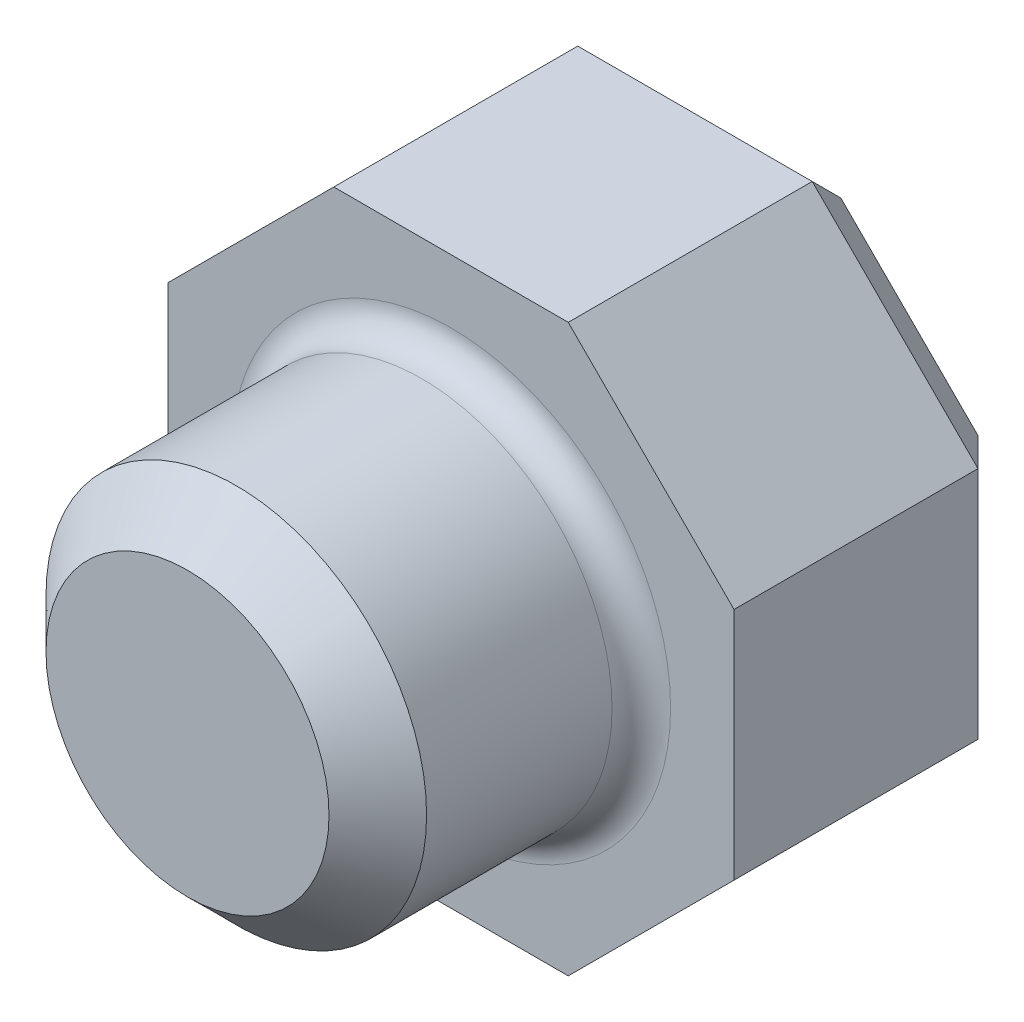
ISO-10303-21;
HEADER;
FILE_DESCRIPTION(('STEP AP214'),'2;1');
FILE_NAME('part.step','',(''),(''),'','','');
FILE_SCHEMA(('AUTOMOTIVE_DESIGN { 1 0 10303 214 1 1 1 1 }'));
ENDSEC;
DATA;
#1=APPLICATION_CONTEXT('core data for automotive mechanical design processes');
#2=APPLICATION_PROTOCOL_DEFINITION('international standard','automotive_design',2000,#1);
#3=PRODUCT_CONTEXT('',#1,'mechanical');
#4=PRODUCT('Part','Part','',(#3));
#5=PRODUCT_RELATED_PRODUCT_CATEGORY('part','',(#4));
#6=PRODUCT_DEFINITION_FORMATION('','',#4);
#7=PRODUCT_DEFINITION_CONTEXT('part definition',#1,'design');
#8=PRODUCT_DEFINITION('design','',#6,#7);
#9=PRODUCT_DEFINITION_SHAPE('','',#8);
#10=(LENGTH_UNIT() NAMED_UNIT(*) SI_UNIT(.MILLI.,.METRE.));
#11=(NAMED_UNIT(*) PLANE_ANGLE_UNIT() SI_UNIT($,.RADIAN.));
#12=(NAMED_UNIT(*) SI_UNIT($,.STERADIAN.) SOLID_ANGLE_UNIT());
#13=UNCERTAINTY_MEASURE_WITH_UNIT(LENGTH_MEASURE(1.E-05),#10,'distance_accuracy_value','');
#14=(GEOMETRIC_REPRESENTATION_CONTEXT(3) GLOBAL_UNCERTAINTY_ASSIGNED_CONTEXT((#13)) GLOBAL_UNIT_ASSIGNED_CONTEXT((#10,
#11,#12)) REPRESENTATION_CONTEXT('',''));
#15=CARTESIAN_POINT('',(0.,0.,0.));
#16=DIRECTION('',(0.,0.,1.));
#17=DIRECTION('',(1.,0.,0.));
#18=AXIS2_PLACEMENT_3D('',#15,#16,#17);
#19=CARTESIAN_POINT('',(5.8,2.40243866176395,6.));
#20=DIRECTION('',(-0.707106781186548,-0.707106781186547,0.));
#21=DIRECTION('',(0.707106781186547,-0.707106781186548,0.));
#22=AXIS2_PLACEMENT_3D('',#19,#20,#21);
#23=PLANE('',#22);
#24=DIRECTION('',(0.,0.,-1.));
#25=VECTOR('',#24,1.);
#26=CARTESIAN_POINT('',(5.8,2.40243866176395,6.));
#27=LINE('',#26,#25);
#28=CARTESIAN_POINT('',(5.8,2.40243866176395,6.));
#29=VERTEX_POINT('',#28);
#30=CARTESIAN_POINT('',(5.8,2.40243866176395,1.));
#31=VERTEX_POINT('',#30);
#32=EDGE_CURVE('E250',#29,#31,#27,.T.);
#33=ORIENTED_EDGE('',*,*,#32,.T.);
#34=DIRECTION('',(-0.707106781186547,0.707106781186548,0.));
#35=VECTOR('',#34,1.);
#36=CARTESIAN_POINT('',(5.8,2.40243866176395,1.));
#37=LINE('',#36,#35);
#38=CARTESIAN_POINT('',(2.40243866176395,5.8,1.));
#39=VERTEX_POINT('',#38);
#40=EDGE_CURVE('E11',#31,#39,#37,.T.);
#41=ORIENTED_EDGE('',*,*,#40,.T.);
#42=DIRECTION('',(0.,0.,-1.));
#43=VECTOR('',#42,1.);
#44=CARTESIAN_POINT('',(2.40243866176395,5.8,6.));
#45=LINE('',#44,#43);
#46=CARTESIAN_POINT('',(2.40243866176395,5.8,6.));
#47=VERTEX_POINT('',#46);
#48=EDGE_CURVE('E133',#47,#39,#45,.T.);
#49=ORIENTED_EDGE('',*,*,#48,.F.);
#50=DIRECTION('',(-0.707106781186547,0.707106781186548,0.));
#51=VECTOR('',#50,1.);
#52=CARTESIAN_POINT('',(5.8,2.40243866176395,6.));
#53=LINE('',#52,#51);
#54=EDGE_CURVE('E138',#29,#47,#53,.T.);
#55=ORIENTED_EDGE('',*,*,#54,.F.);
#56=EDGE_LOOP('',(#33,#41,#49,#55));
#57=FACE_BOUND('',#56,.T.);
#58=ADVANCED_FACE('F41',(#57),#23,.F.);
#59=CARTESIAN_POINT('',(2.40243866176395,5.8,6.));
#60=DIRECTION('',(0.,-1.,0.));
#61=DIRECTION('',(1.,0.,0.));
#62=AXIS2_PLACEMENT_3D('',#59,#60,#61);
#63=PLANE('',#62);
#64=ORIENTED_EDGE('',*,*,#48,.T.);
#65=DIRECTION('',(-1.,0.,0.));
#66=VECTOR('',#65,1.);
#67=CARTESIAN_POINT('',(2.40243866176395,5.8,1.));
#68=LINE('',#67,#66);
#69=CARTESIAN_POINT('',(-2.40243866176395,5.8,1.));
#70=VERTEX_POINT('',#69);
#71=EDGE_CURVE('E51',#39,#70,#68,.T.);
#72=ORIENTED_EDGE('',*,*,#71,.T.);
#73=DIRECTION('',(0.,0.,-1.));
#74=VECTOR('',#73,1.);
#75=CARTESIAN_POINT('',(-2.40243866176395,5.8,6.));
#76=LINE('',#75,#74);
#77=CARTESIAN_POINT('',(-2.40243866176395,5.8,6.));
#78=VERTEX_POINT('',#77);
#79=EDGE_CURVE('E134',#78,#70,#76,.T.);
#80=ORIENTED_EDGE('',*,*,#79,.F.);
#81=DIRECTION('',(-1.,0.,0.));
#82=VECTOR('',#81,1.);
#83=CARTESIAN_POINT('',(2.40243866176395,5.8,6.));
#84=LINE('',#83,#82);
#85=EDGE_CURVE('E130',#47,#78,#84,.T.);
#86=ORIENTED_EDGE('',*,*,#85,.F.);
#87=EDGE_LOOP('',(#64,#72,#80,#86));
#88=FACE_BOUND('',#87,.T.);
#89=ADVANCED_FACE('F132',(#88),#63,.F.);
#90=CARTESIAN_POINT('',(-2.40243866176395,5.8,6.));
#91=DIRECTION('',(0.707106781186547,-0.707106781186548,0.));
#92=DIRECTION('',(0.707106781186548,0.707106781186547,0.));
#93=AXIS2_PLACEMENT_3D('',#90,#91,#92);
#94=PLANE('',#93);
#95=ORIENTED_EDGE('',*,*,#79,.T.);
#96=DIRECTION('',(-0.707106781186548,-0.707106781186547,0.));
#97=VECTOR('',#96,1.);
#98=CARTESIAN_POINT('',(-2.40243866176395,5.8,1.));
#99=LINE('',#98,#97);
#100=CARTESIAN_POINT('',(-5.8,2.40243866176395,1.));
#101=VERTEX_POINT('',#100);
#102=EDGE_CURVE('E191',#70,#101,#99,.T.);
#103=ORIENTED_EDGE('',*,*,#102,.T.);
#104=DIRECTION('',(0.,0.,-1.));
#105=VECTOR('',#104,1.);
#106=CARTESIAN_POINT('',(-5.8,2.40243866176395,6.));
#107=LINE('',#106,#105);
#108=CARTESIAN_POINT('',(-5.8,2.40243866176395,6.));
#109=VERTEX_POINT('',#108);
#110=EDGE_CURVE('E151',#109,#101,#107,.T.);
#111=ORIENTED_EDGE('',*,*,#110,.F.);
#112=DIRECTION('',(-0.707106781186547,-0.707106781186547,0.));
#113=VECTOR('',#112,1.);
#114=CARTESIAN_POINT('',(-2.40243866176395,5.8,6.));
#115=LINE('',#114,#113);
#116=EDGE_CURVE('E137',#78,#109,#115,.T.);
#117=ORIENTED_EDGE('',*,*,#116,.F.);
#118=EDGE_LOOP('',(#95,#103,#111,#117));
#119=FACE_BOUND('',#118,.T.);
#120=ADVANCED_FACE('F269',(#119),#94,.F.);
#121=CARTESIAN_POINT('',(-5.8,2.40243866176395,6.));
#122=DIRECTION('',(1.,0.,0.));
#123=DIRECTION('',(0.,1.,0.));
#124=AXIS2_PLACEMENT_3D('',#121,#122,#123);
#125=PLANE('',#124);
#126=ORIENTED_EDGE('',*,*,#110,.T.);
#127=DIRECTION('',(0.,-1.,0.));
#128=VECTOR('',#127,1.);
#129=CARTESIAN_POINT('',(-5.8,2.40243866176395,1.));
#130=LINE('',#129,#128);
#131=CARTESIAN_POINT('',(-5.8,-2.40243866176395,1.));
#132=VERTEX_POINT('',#131);
#133=EDGE_CURVE('E189',#101,#132,#130,.T.);
#134=ORIENTED_EDGE('',*,*,#133,.T.);
#135=DIRECTION('',(0.,0.,-1.));
#136=VECTOR('',#135,1.);
#137=CARTESIAN_POINT('',(-5.8,-2.40243866176395,6.));
#138=LINE('',#137,#136);
#139=CARTESIAN_POINT('',(-5.8,-2.40243866176395,6.));
#140=VERTEX_POINT('',#139);
#141=EDGE_CURVE('E259',#140,#132,#138,.T.);
#142=ORIENTED_EDGE('',*,*,#141,.F.);
#143=DIRECTION('',(0.,-1.,0.));
#144=VECTOR('',#143,1.);
#145=CARTESIAN_POINT('',(-5.8,2.40243866176395,6.));
#146=LINE('',#145,#144);
#147=EDGE_CURVE('E267',#109,#140,#146,.T.);
#148=ORIENTED_EDGE('',*,*,#147,.F.);
#149=EDGE_LOOP('',(#126,#134,#142,#148));
#150=FACE_BOUND('',#149,.T.);
#151=ADVANCED_FACE('F265',(#150),#125,.F.);
#152=CARTESIAN_POINT('',(-5.8,-2.40243866176395,6.));
#153=DIRECTION('',(0.707106781186548,0.707106781186547,0.));
#154=DIRECTION('',(-0.707106781186547,0.707106781186548,0.));
#155=AXIS2_PLACEMENT_3D('',#152,#153,#154);
#156=PLANE('',#155);
#157=ORIENTED_EDGE('',*,*,#141,.T.);
#158=DIRECTION('',(0.707106781186547,-0.707106781186548,0.));
#159=VECTOR('',#158,1.);
#160=CARTESIAN_POINT('',(-5.8,-2.40243866176395,1.));
#161=LINE('',#160,#159);
#162=CARTESIAN_POINT('',(-2.40243866176395,-5.8,1.));
#163=VERTEX_POINT('',#162);
#164=EDGE_CURVE('E187',#132,#163,#161,.T.);
#165=ORIENTED_EDGE('',*,*,#164,.T.);
#166=DIRECTION('',(0.,0.,-1.));
#167=VECTOR('',#166,1.);
#168=CARTESIAN_POINT('',(-2.40243866176395,-5.8,6.));
#169=LINE('',#168,#167);
#170=CARTESIAN_POINT('',(-2.40243866176395,-5.8,6.));
#171=VERTEX_POINT('',#170);
#172=EDGE_CURVE('E252',#171,#163,#169,.T.);
#173=ORIENTED_EDGE('',*,*,#172,.F.);
#174=DIRECTION('',(0.707106781186547,-0.707106781186548,0.));
#175=VECTOR('',#174,1.);
#176=CARTESIAN_POINT('',(-5.8,-2.40243866176395,6.));
#177=LINE('',#176,#175);
#178=EDGE_CURVE('E504',#140,#171,#177,.T.);
#179=ORIENTED_EDGE('',*,*,#178,.F.);
#180=EDGE_LOOP('',(#157,#165,#173,#179));
#181=FACE_BOUND('',#180,.T.);
#182=ADVANCED_FACE('F375',(#181),#156,.F.);
#183=CARTESIAN_POINT('',(-2.40243866176395,-5.8,6.));
#184=DIRECTION('',(0.,1.,0.));
#185=DIRECTION('',(-1.,0.,0.));
#186=AXIS2_PLACEMENT_3D('',#183,#184,#185);
#187=PLANE('',#186);
#188=ORIENTED_EDGE('',*,*,#172,.T.);
#189=DIRECTION('',(1.,0.,0.));
#190=VECTOR('',#189,1.);
#191=CARTESIAN_POINT('',(-2.40243866176395,-5.8,1.));
#192=LINE('',#191,#190);
#193=CARTESIAN_POINT('',(2.40243866176395,-5.8,1.));
#194=VERTEX_POINT('',#193);
#195=EDGE_CURVE('E185',#163,#194,#192,.T.);
#196=ORIENTED_EDGE('',*,*,#195,.T.);
#197=DIRECTION('',(0.,0.,-1.));
#198=VECTOR('',#197,1.);
#199=CARTESIAN_POINT('',(2.40243866176395,-5.8,6.));
#200=LINE('',#199,#198);
#201=CARTESIAN_POINT('',(2.40243866176395,-5.8,6.));
#202=VERTEX_POINT('',#201);
#203=EDGE_CURVE('E247',#202,#194,#200,.T.);
#204=ORIENTED_EDGE('',*,*,#203,.F.);
#205=DIRECTION('',(1.,0.,0.));
#206=VECTOR('',#205,1.);
#207=CARTESIAN_POINT('',(-2.40243866176395,-5.8,6.));
#208=LINE('',#207,#206);
#209=EDGE_CURVE('E506',#171,#202,#208,.T.);
#210=ORIENTED_EDGE('',*,*,#209,.F.);
#211=EDGE_LOOP('',(#188,#196,#204,#210));
#212=FACE_BOUND('',#211,.T.);
#213=ADVANCED_FACE('F367',(#212),#187,.F.);
#214=CARTESIAN_POINT('',(2.40243866176395,-5.8,6.));
#215=DIRECTION('',(-0.707106781186548,0.707106781186547,0.));
#216=DIRECTION('',(-0.707106781186547,-0.707106781186548,0.));
#217=AXIS2_PLACEMENT_3D('',#214,#215,#216);
#218=PLANE('',#217);
#219=ORIENTED_EDGE('',*,*,#203,.T.);
#220=DIRECTION('',(0.707106781186547,0.707106781186548,0.));
#221=VECTOR('',#220,1.);
#222=CARTESIAN_POINT('',(2.40243866176395,-5.8,1.));
#223=LINE('',#222,#221);
#224=CARTESIAN_POINT('',(5.8,-2.40243866176395,1.));
#225=VERTEX_POINT('',#224);
#226=EDGE_CURVE('E183',#194,#225,#223,.T.);
#227=ORIENTED_EDGE('',*,*,#226,.T.);
#228=DIRECTION('',(0.,0.,-1.));
#229=VECTOR('',#228,1.);
#230=CARTESIAN_POINT('',(5.8,-2.40243866176395,6.));
#231=LINE('',#230,#229);
#232=CARTESIAN_POINT('',(5.8,-2.40243866176395,6.));
#233=VERTEX_POINT('',#232);
#234=EDGE_CURVE('E245',#233,#225,#231,.T.);
#235=ORIENTED_EDGE('',*,*,#234,.F.);
#236=DIRECTION('',(0.707106781186547,0.707106781186548,0.));
#237=VECTOR('',#236,1.);
#238=CARTESIAN_POINT('',(2.40243866176395,-5.8,6.));
#239=LINE('',#238,#237);
#240=EDGE_CURVE('E508',#202,#233,#239,.T.);
#241=ORIENTED_EDGE('',*,*,#240,.F.);
#242=EDGE_LOOP('',(#219,#227,#235,#241));
#243=FACE_BOUND('',#242,.T.);
#244=ADVANCED_FACE('F243',(#243),#218,.F.);
#245=CARTESIAN_POINT('',(5.8,-2.40243866176395,6.));
#246=DIRECTION('',(-1.,0.,0.));
#247=DIRECTION('',(0.,0.,1.));
#248=AXIS2_PLACEMENT_3D('',#245,#246,#247);
#249=PLANE('',#248);
#250=ORIENTED_EDGE('',*,*,#234,.T.);
#251=DIRECTION('',(0.,1.,0.));
#252=VECTOR('',#251,1.);
#253=CARTESIAN_POINT('',(5.8,-2.40243866176395,1.));
#254=LINE('',#253,#252);
#255=EDGE_CURVE('E163',#225,#31,#254,.T.);
#256=ORIENTED_EDGE('',*,*,#255,.T.);
#257=ORIENTED_EDGE('',*,*,#32,.F.);
#258=DIRECTION('',(0.,1.,0.));
#259=VECTOR('',#258,1.);
#260=CARTESIAN_POINT('',(5.8,-2.40243866176395,6.));
#261=LINE('',#260,#259);
#262=EDGE_CURVE('E143',#233,#29,#261,.T.);
#263=ORIENTED_EDGE('',*,*,#262,.F.);
#264=EDGE_LOOP('',(#250,#256,#257,#263));
#265=FACE_BOUND('',#264,.T.);
#266=ADVANCED_FACE('F249',(#265),#249,.F.);
#267=CARTESIAN_POINT('',(0.,0.,6.));
#268=DIRECTION('',(0.,0.,1.));
#269=DIRECTION('',(1.,0.,0.));
#270=AXIS2_PLACEMENT_3D('',#267,#268,#269);
#271=PLANE('',#270);
#272=CARTESIAN_POINT('',(0.,0.,6.));
#273=DIRECTION('',(0.,0.,1.));
#274=DIRECTION('',(1.,0.,0.));
#275=AXIS2_PLACEMENT_3D('',#272,#273,#274);
#276=CIRCLE('',#275,4.5);
#277=CARTESIAN_POINT('',(4.5,0.,6.));
#278=VERTEX_POINT('',#277);
#279=EDGE_CURVE('E160',#278,#278,#276,.F.);
#280=ORIENTED_EDGE('',*,*,#279,.T.);
#281=EDGE_LOOP('',(#280));
#282=FACE_BOUND('',#281,.T.);
#283=ORIENTED_EDGE('',*,*,#54,.T.);
#284=ORIENTED_EDGE('',*,*,#85,.T.);
#285=ORIENTED_EDGE('',*,*,#116,.T.);
#286=ORIENTED_EDGE('',*,*,#147,.T.);
#287=ORIENTED_EDGE('',*,*,#178,.T.);
#288=ORIENTED_EDGE('',*,*,#209,.T.);
#289=ORIENTED_EDGE('',*,*,#240,.T.);
#290=ORIENTED_EDGE('',*,*,#262,.T.);
#291=EDGE_LOOP('',(#283,#284,#285,#286,#287,#288,#289,#290));
#292=FACE_BOUND('',#291,.T.);
#293=ADVANCED_FACE('F141',(#282,#292),#271,.T.);
#294=CARTESIAN_POINT('',(0.,0.,0.));
#295=DIRECTION('',(0.,0.,1.));
#296=DIRECTION('',(1.,0.,0.));
#297=AXIS2_PLACEMENT_3D('',#294,#295,#296);
#298=PLANE('',#297);
#299=DIRECTION('',(0.707106781186547,-0.707106781186548,0.));
#300=VECTOR('',#299,1.);
#301=CARTESIAN_POINT('',(3.39411254969543,3.39411254969543,0.));
#302=LINE('',#301,#300);
#303=CARTESIAN_POINT('',(1.98822509939086,4.8,0.));
#304=VERTEX_POINT('',#303);
#305=CARTESIAN_POINT('',(4.8,1.98822509939086,0.));
#306=VERTEX_POINT('',#305);
#307=EDGE_CURVE('E166',#304,#306,#302,.T.);
#308=ORIENTED_EDGE('',*,*,#307,.T.);
#309=DIRECTION('',(0.,-1.,0.));
#310=VECTOR('',#309,1.);
#311=CARTESIAN_POINT('',(4.8,0.,0.));
#312=LINE('',#311,#310);
#313=CARTESIAN_POINT('',(4.8,-1.98822509939085,0.));
#314=VERTEX_POINT('',#313);
#315=EDGE_CURVE('E180',#306,#314,#312,.T.);
#316=ORIENTED_EDGE('',*,*,#315,.T.);
#317=DIRECTION('',(-0.707106781186547,-0.707106781186548,0.));
#318=VECTOR('',#317,1.);
#319=CARTESIAN_POINT('',(3.39411254969543,-3.39411254969543,0.));
#320=LINE('',#319,#318);
#321=CARTESIAN_POINT('',(1.98822509939086,-4.8,0.));
#322=VERTEX_POINT('',#321);
#323=EDGE_CURVE('E178',#314,#322,#320,.T.);
#324=ORIENTED_EDGE('',*,*,#323,.T.);
#325=DIRECTION('',(-1.,0.,0.));
#326=VECTOR('',#325,1.);
#327=CARTESIAN_POINT('',(0.,-4.8,0.));
#328=LINE('',#327,#326);
#329=CARTESIAN_POINT('',(-1.98822509939086,-4.8,0.));
#330=VERTEX_POINT('',#329);
#331=EDGE_CURVE('E176',#322,#330,#328,.T.);
#332=ORIENTED_EDGE('',*,*,#331,.T.);
#333=DIRECTION('',(-0.707106781186547,0.707106781186548,0.));
#334=VECTOR('',#333,1.);
#335=CARTESIAN_POINT('',(-3.39411254969543,-3.39411254969543,0.));
#336=LINE('',#335,#334);
#337=CARTESIAN_POINT('',(-4.8,-1.98822509939086,0.));
#338=VERTEX_POINT('',#337);
#339=EDGE_CURVE('E174',#330,#338,#336,.T.);
#340=ORIENTED_EDGE('',*,*,#339,.T.);
#341=DIRECTION('',(0.,1.,0.));
#342=VECTOR('',#341,1.);
#343=CARTESIAN_POINT('',(-4.8,0.,0.));
#344=LINE('',#343,#342);
#345=CARTESIAN_POINT('',(-4.8,1.98822509939085,0.));
#346=VERTEX_POINT('',#345);
#347=EDGE_CURVE('E172',#338,#346,#344,.T.);
#348=ORIENTED_EDGE('',*,*,#347,.T.);
#349=DIRECTION('',(0.707106781186548,0.707106781186547,0.));
#350=VECTOR('',#349,1.);
#351=CARTESIAN_POINT('',(-3.39411254969543,3.39411254969543,0.));
#352=LINE('',#351,#350);
#353=CARTESIAN_POINT('',(-1.98822509939086,4.8,0.));
#354=VERTEX_POINT('',#353);
#355=EDGE_CURVE('E170',#346,#354,#352,.T.);
#356=ORIENTED_EDGE('',*,*,#355,.T.);
#357=DIRECTION('',(1.,0.,0.));
#358=VECTOR('',#357,1.);
#359=CARTESIAN_POINT('',(0.,4.8,0.));
#360=LINE('',#359,#358);
#361=EDGE_CURVE('E168',#354,#304,#360,.T.);
#362=ORIENTED_EDGE('',*,*,#361,.T.);
#363=EDGE_LOOP('',(#308,#316,#324,#332,#340,#348,#356,#362));
#364=FACE_BOUND('',#363,.T.);
#365=ADVANCED_FACE('F226',(#364),#298,.F.);
#366=CARTESIAN_POINT('',(0.,0.,11.4));
#367=DIRECTION('',(0.,0.,-1.));
#368=DIRECTION('',(-1.,0.,0.));
#369=AXIS2_PLACEMENT_3D('',#366,#367,#368);
#370=CYLINDRICAL_SURFACE('',#369,3.9);
#371=CARTESIAN_POINT('',(0.,0.,6.6));
#372=DIRECTION('',(0.,0.,1.));
#373=DIRECTION('',(1.,0.,0.));
#374=AXIS2_PLACEMENT_3D('',#371,#372,#373);
#375=CIRCLE('',#374,3.9);
#376=CARTESIAN_POINT('',(-3.9,0.,6.6));
#377=VERTEX_POINT('',#376);
#378=EDGE_CURVE('E157',#377,#377,#375,.T.);
#379=CARTESIAN_POINT('',(0.,0.,10.4));
#380=DIRECTION('',(0.,0.,1.));
#381=DIRECTION('',(1.,0.,0.));
#382=AXIS2_PLACEMENT_3D('',#379,#380,#381);
#383=CIRCLE('',#382,3.9);
#384=CARTESIAN_POINT('',(-3.9,0.,10.4));
#385=VERTEX_POINT('',#384);
#386=EDGE_CURVE('E149',#385,#385,#383,.F.);
#387=CARTESIAN_POINT('',(-3.9,0.,6.6));
#388=CARTESIAN_POINT('',(-3.9,0.,6.63958333333333));
#389=CARTESIAN_POINT('',(-3.9,0.,6.67916666666667));
#390=CARTESIAN_POINT('',(-3.9,0.,6.75833333333333));
#391=CARTESIAN_POINT('',(-3.9,0.,6.79791666666667));
#392=CARTESIAN_POINT('',(-3.9,0.,6.87708333333333));
#393=CARTESIAN_POINT('',(-3.9,0.,6.91666666666667));
#394=CARTESIAN_POINT('',(-3.9,0.,6.99583333333333));
#395=CARTESIAN_POINT('',(-3.9,0.,7.03541666666667));
#396=CARTESIAN_POINT('',(-3.9,0.,7.11458333333333));
#397=CARTESIAN_POINT('',(-3.9,0.,7.15416666666667));
#398=CARTESIAN_POINT('',(-3.9,0.,7.23333333333333));
#399=CARTESIAN_POINT('',(-3.9,0.,7.27291666666667));
#400=CARTESIAN_POINT('',(-3.9,0.,7.35208333333333));
#401=CARTESIAN_POINT('',(-3.9,0.,7.39166666666667));
#402=CARTESIAN_POINT('',(-3.9,0.,7.47083333333333));
#403=CARTESIAN_POINT('',(-3.9,0.,7.51041666666667));
#404=CARTESIAN_POINT('',(-3.9,0.,7.58958333333333));
#405=CARTESIAN_POINT('',(-3.9,0.,7.62916666666667));
#406=CARTESIAN_POINT('',(-3.9,0.,7.70833333333333));
#407=CARTESIAN_POINT('',(-3.9,0.,7.74791666666667));
#408=CARTESIAN_POINT('',(-3.9,0.,7.82708333333333));
#409=CARTESIAN_POINT('',(-3.9,0.,7.86666666666667));
#410=CARTESIAN_POINT('',(-3.9,0.,7.94583333333333));
#411=CARTESIAN_POINT('',(-3.9,0.,7.98541666666667));
#412=CARTESIAN_POINT('',(-3.9,0.,8.06458333333333));
#413=CARTESIAN_POINT('',(-3.9,0.,8.10416666666667));
#414=CARTESIAN_POINT('',(-3.9,0.,8.18333333333334));
#415=CARTESIAN_POINT('',(-3.9,0.,8.22291666666667));
#416=CARTESIAN_POINT('',(-3.9,0.,8.30208333333334));
#417=CARTESIAN_POINT('',(-3.9,0.,8.34166666666667));
#418=CARTESIAN_POINT('',(-3.9,0.,8.42083333333334));
#419=CARTESIAN_POINT('',(-3.9,0.,8.46041666666667));
#420=CARTESIAN_POINT('',(-3.9,0.,8.53958333333333));
#421=CARTESIAN_POINT('',(-3.9,0.,8.57916666666667));
#422=CARTESIAN_POINT('',(-3.9,0.,8.65833333333333));
#423=CARTESIAN_POINT('',(-3.9,0.,8.69791666666667));
#424=CARTESIAN_POINT('',(-3.9,0.,8.77708333333334));
#425=CARTESIAN_POINT('',(-3.9,0.,8.81666666666667));
#426=CARTESIAN_POINT('',(-3.9,0.,8.89583333333334));
#427=CARTESIAN_POINT('',(-3.9,0.,8.93541666666667));
#428=CARTESIAN_POINT('',(-3.9,0.,9.01458333333334));
#429=CARTESIAN_POINT('',(-3.9,0.,9.05416666666667));
#430=CARTESIAN_POINT('',(-3.9,0.,9.13333333333334));
#431=CARTESIAN_POINT('',(-3.9,0.,9.17291666666667));
#432=CARTESIAN_POINT('',(-3.9,0.,9.25208333333334));
#433=CARTESIAN_POINT('',(-3.9,0.,9.29166666666667));
#434=CARTESIAN_POINT('',(-3.9,0.,9.37083333333334));
#435=CARTESIAN_POINT('',(-3.9,0.,9.41041666666667));
#436=CARTESIAN_POINT('',(-3.9,0.,9.48958333333334));
#437=CARTESIAN_POINT('',(-3.9,0.,9.52916666666667));
#438=CARTESIAN_POINT('',(-3.9,0.,9.60833333333334));
#439=CARTESIAN_POINT('',(-3.9,0.,9.64791666666667));
#440=CARTESIAN_POINT('',(-3.9,0.,9.72708333333334));
#441=CARTESIAN_POINT('',(-3.9,0.,9.76666666666667));
#442=CARTESIAN_POINT('',(-3.9,0.,9.84583333333334));
#443=CARTESIAN_POINT('',(-3.9,0.,9.88541666666667));
#444=CARTESIAN_POINT('',(-3.9,0.,9.96458333333334));
#445=CARTESIAN_POINT('',(-3.9,0.,10.0041666666667));
#446=CARTESIAN_POINT('',(-3.9,0.,10.0833333333333));
#447=CARTESIAN_POINT('',(-3.9,0.,10.1229166666667));
#448=CARTESIAN_POINT('',(-3.9,0.,10.2020833333333));
#449=CARTESIAN_POINT('',(-3.9,0.,10.2416666666667));
#450=CARTESIAN_POINT('',(-3.9,0.,10.3208333333333));
#451=CARTESIAN_POINT('',(-3.9,0.,10.3604166666667));
#452=CARTESIAN_POINT('',(-3.9,0.,10.4));
#453=B_SPLINE_CURVE_WITH_KNOTS('',3,(#387,#388,#389,#390,#391,#392,#393,#394,#395,#396,#397,
#398,#399,#400,#401,#402,#403,#404,#405,#406,#407,#408,#409,#410,#411,#412,#413,#414,#415,#416,
#417,#418,#419,#420,#421,#422,#423,#424,#425,#426,#427,#428,#429,#430,#431,#432,#433,#434,#435,
#436,#437,#438,#439,#440,#441,#442,#443,#444,#445,#446,#447,#448,#449,#450,#451,#452),
.UNSPECIFIED.,.F.,.F.,(4,2,2,2,2,2,2,2,2,2,2,2,2,2,2,2,2,2,2,2,2,2,2,2,2,2,2,2,2,2,2,2,4),(0.,
0.11875,0.237500000000001,0.356250000000001,0.475000000000001,0.593750000000001,
0.712500000000001,0.831250000000001,0.950000000000001,1.06875,1.1875,1.30625,1.425,1.54375,
1.6625,1.78125,1.9,2.01875,2.1375,2.25625,2.375,2.49375,2.6125,2.73125,2.85,2.96875000000001,
3.0875,3.20625000000001,3.32500000000001,3.44375,3.56250000000001,3.68125000000001,
3.80000000000001),.UNSPECIFIED.);
#454=EDGE_CURVE('BSEAM350',#377,#385,#453,.T.);
#455=ORIENTED_EDGE('',*,*,#378,.T.);
#456=ORIENTED_EDGE('',*,*,#386,.T.);
#457=ORIENTED_EDGE('',*,*,#454,.T.);
#458=ORIENTED_EDGE('',*,*,#454,.F.);
#459=EDGE_LOOP('',(#455,#457,#456,#458));
#460=FACE_BOUND('',#459,.T.);
#461=ADVANCED_FACE('F350',(#460),#370,.T.);
#462=CARTESIAN_POINT('',(0.,0.,11.4));
#463=DIRECTION('',(0.,0.,1.));
#464=DIRECTION('',(1.,0.,0.));
#465=AXIS2_PLACEMENT_3D('',#462,#463,#464);
#466=PLANE('',#465);
#467=CARTESIAN_POINT('',(0.,0.,11.4));
#468=DIRECTION('',(0.,0.,1.));
#469=DIRECTION('',(1.,0.,0.));
#470=AXIS2_PLACEMENT_3D('',#467,#468,#469);
#471=CIRCLE('',#470,2.90000000000001);
#472=CARTESIAN_POINT('',(2.90000000000001,0.,11.4));
#473=VERTEX_POINT('',#472);
#474=EDGE_CURVE('E146',#473,#473,#471,.T.);
#475=ORIENTED_EDGE('',*,*,#474,.T.);
#476=EDGE_LOOP('',(#475));
#477=FACE_BOUND('',#476,.T.);
#478=ADVANCED_FACE('F307',(#477),#466,.T.);
#479=CARTESIAN_POINT('',(0.,0.,11.4));
#480=DIRECTION('',(0.,0.,-1.));
#481=DIRECTION('',(-1.,0.,0.));
#482=AXIS2_PLACEMENT_3D('',#479,#480,#481);
#483=CONICAL_SURFACE('',#482,2.90000000000001,0.785398163397447);
#484=ORIENTED_EDGE('',*,*,#386,.F.);
#485=EDGE_LOOP('',(#484));
#486=FACE_BOUND('',#485,.T.);
#487=ORIENTED_EDGE('',*,*,#474,.F.);
#488=EDGE_LOOP('',(#487));
#489=FACE_BOUND('',#488,.T.);
#490=ADVANCED_FACE('F301',(#486,#489),#483,.T.);
#491=CARTESIAN_POINT('',(0.,0.,6.6));
#492=DIRECTION('',(0.,0.,1.));
#493=DIRECTION('',(1.,0.,0.));
#494=AXIS2_PLACEMENT_3D('',#491,#492,#493);
#495=TOROIDAL_SURFACE('',#494,4.5,0.6);
#496=ORIENTED_EDGE('',*,*,#279,.F.);
#497=EDGE_LOOP('',(#496));
#498=FACE_BOUND('',#497,.T.);
#499=ORIENTED_EDGE('',*,*,#378,.F.);
#500=EDGE_LOOP('',(#499));
#501=FACE_BOUND('',#500,.T.);
#502=ADVANCED_FACE('F306',(#498,#501),#495,.F.);
#503=CARTESIAN_POINT('',(-5.8,2.40243866176395,1.));
#504=DIRECTION('',(0.707106781186547,0.,0.707106781186548));
#505=DIRECTION('',(0.,-1.,0.));
#506=AXIS2_PLACEMENT_3D('',#503,#504,#505);
#507=PLANE('',#506);
#508=DIRECTION('',(-0.678598344545848,0.28108463771482,0.678598344545847));
#509=VECTOR('',#508,1.);
#510=CARTESIAN_POINT('',(-4.88350054671245,2.02281215830472,0.0835005467124474));
#511=LINE('',#510,#509);
#512=EDGE_CURVE('E209',#346,#101,#511,.T.);
#513=ORIENTED_EDGE('',*,*,#512,.F.);
#514=ORIENTED_EDGE('',*,*,#347,.F.);
#515=DIRECTION('',(-0.678598344545847,-0.28108463771482,0.678598344545847));
#516=VECTOR('',#515,1.);
#517=CARTESIAN_POINT('',(-4.88350054671245,-2.02281215830472,0.0835005467124507));
#518=LINE('',#517,#516);
#519=EDGE_CURVE('E46',#132,#338,#518,.F.);
#520=ORIENTED_EDGE('',*,*,#519,.F.);
#521=ORIENTED_EDGE('',*,*,#133,.F.);
#522=EDGE_LOOP('',(#513,#514,#520,#521));
#523=FACE_BOUND('',#522,.T.);
#524=ADVANCED_FACE('F44',(#523),#507,.F.);
#525=CARTESIAN_POINT('',(-5.8,-2.40243866176395,1.));
#526=DIRECTION('',(0.5,0.5,0.707106781186548));
#527=DIRECTION('',(0.707106781186547,-0.707106781186548,0.));
#528=AXIS2_PLACEMENT_3D('',#525,#526,#527);
#529=PLANE('',#528);
#530=ORIENTED_EDGE('',*,*,#519,.T.);
#531=ORIENTED_EDGE('',*,*,#339,.F.);
#532=DIRECTION('',(-0.28108463771482,-0.678598344545848,0.678598344545847));
#533=VECTOR('',#532,1.);
#534=CARTESIAN_POINT('',(-2.02281215830472,-4.88350054671244,0.0835005467124454));
#535=LINE('',#534,#533);
#536=EDGE_CURVE('E207',#163,#330,#535,.F.);
#537=ORIENTED_EDGE('',*,*,#536,.F.);
#538=ORIENTED_EDGE('',*,*,#164,.F.);
#539=EDGE_LOOP('',(#530,#531,#537,#538));
#540=FACE_BOUND('',#539,.T.);
#541=ADVANCED_FACE('F220',(#540),#529,.F.);
#542=CARTESIAN_POINT('',(-2.40243866176395,5.8,1.));
#543=DIRECTION('',(0.5,-0.5,0.707106781186548));
#544=DIRECTION('',(-0.707106781186548,-0.707106781186547,0.));
#545=AXIS2_PLACEMENT_3D('',#542,#543,#544);
#546=PLANE('',#545);
#547=ORIENTED_EDGE('',*,*,#512,.T.);
#548=ORIENTED_EDGE('',*,*,#102,.F.);
#549=DIRECTION('',(-0.28108463771482,0.678598344545848,0.678598344545846));
#550=VECTOR('',#549,1.);
#551=CARTESIAN_POINT('',(-2.02281215830472,4.88350054671245,0.0835005467124508));
#552=LINE('',#551,#550);
#553=EDGE_CURVE('E204',#354,#70,#552,.T.);
#554=ORIENTED_EDGE('',*,*,#553,.F.);
#555=ORIENTED_EDGE('',*,*,#355,.F.);
#556=EDGE_LOOP('',(#547,#548,#554,#555));
#557=FACE_BOUND('',#556,.T.);
#558=ADVANCED_FACE('F270',(#557),#546,.F.);
#559=CARTESIAN_POINT('',(-2.40243866176395,-5.8,1.));
#560=DIRECTION('',(0.,0.707106781186547,0.707106781186548));
#561=DIRECTION('',(1.,0.,0.));
#562=AXIS2_PLACEMENT_3D('',#559,#560,#561);
#563=PLANE('',#562);
#564=ORIENTED_EDGE('',*,*,#536,.T.);
#565=ORIENTED_EDGE('',*,*,#331,.F.);
#566=DIRECTION('',(0.281084637714821,-0.678598344545847,0.678598344545846));
#567=VECTOR('',#566,1.);
#568=CARTESIAN_POINT('',(2.02281215830472,-4.88350054671245,0.0835005467124484));
#569=LINE('',#568,#567);
#570=EDGE_CURVE('E201',#194,#322,#569,.F.);
#571=ORIENTED_EDGE('',*,*,#570,.F.);
#572=ORIENTED_EDGE('',*,*,#195,.F.);
#573=EDGE_LOOP('',(#564,#565,#571,#572));
#574=FACE_BOUND('',#573,.T.);
#575=ADVANCED_FACE('F232',(#574),#563,.F.);
#576=CARTESIAN_POINT('',(2.40243866176395,5.8,1.));
#577=DIRECTION('',(0.,-0.707106781186547,0.707106781186548));
#578=DIRECTION('',(-1.,0.,0.));
#579=AXIS2_PLACEMENT_3D('',#576,#577,#578);
#580=PLANE('',#579);
#581=ORIENTED_EDGE('',*,*,#553,.T.);
#582=ORIENTED_EDGE('',*,*,#71,.F.);
#583=DIRECTION('',(0.28108463771482,0.678598344545848,0.678598344545846));
#584=VECTOR('',#583,1.);
#585=CARTESIAN_POINT('',(2.02281215830472,4.88350054671244,0.0835005467124465));
#586=LINE('',#585,#584);
#587=EDGE_CURVE('E198',#304,#39,#586,.T.);
#588=ORIENTED_EDGE('',*,*,#587,.F.);
#589=ORIENTED_EDGE('',*,*,#361,.F.);
#590=EDGE_LOOP('',(#581,#582,#588,#589));
#591=FACE_BOUND('',#590,.T.);
#592=ADVANCED_FACE('F273',(#591),#580,.F.);
#593=CARTESIAN_POINT('',(2.40243866176395,-5.8,1.));
#594=DIRECTION('',(-0.5,0.499999999999999,0.707106781186548));
#595=DIRECTION('',(0.707106781186547,0.707106781186548,0.));
#596=AXIS2_PLACEMENT_3D('',#593,#594,#595);
#597=PLANE('',#596);
#598=ORIENTED_EDGE('',*,*,#570,.T.);
#599=ORIENTED_EDGE('',*,*,#323,.F.);
#600=DIRECTION('',(0.678598344545848,-0.28108463771482,0.678598344545846));
#601=VECTOR('',#600,1.);
#602=CARTESIAN_POINT('',(4.88350054671245,-2.02281215830472,0.0835005467124487));
#603=LINE('',#602,#601);
#604=EDGE_CURVE('E196',#225,#314,#603,.F.);
#605=ORIENTED_EDGE('',*,*,#604,.F.);
#606=ORIENTED_EDGE('',*,*,#226,.F.);
#607=EDGE_LOOP('',(#598,#599,#605,#606));
#608=FACE_BOUND('',#607,.T.);
#609=ADVANCED_FACE('F236',(#608),#597,.F.);
#610=CARTESIAN_POINT('',(5.8,2.40243866176395,1.));
#611=DIRECTION('',(-0.5,-0.5,0.707106781186548));
#612=DIRECTION('',(-0.707106781186547,0.707106781186548,0.));
#613=AXIS2_PLACEMENT_3D('',#610,#611,#612);
#614=PLANE('',#613);
#615=ORIENTED_EDGE('',*,*,#587,.T.);
#616=ORIENTED_EDGE('',*,*,#40,.F.);
#617=DIRECTION('',(-0.678598344545848,-0.28108463771482,-0.678598344545846));
#618=VECTOR('',#617,1.);
#619=CARTESIAN_POINT('',(5.8,2.40243866176395,1.));
#620=LINE('',#619,#618);
#621=EDGE_CURVE('E194',#306,#31,#620,.F.);
#622=ORIENTED_EDGE('',*,*,#621,.F.);
#623=ORIENTED_EDGE('',*,*,#307,.F.);
#624=EDGE_LOOP('',(#615,#616,#622,#623));
#625=FACE_BOUND('',#624,.T.);
#626=ADVANCED_FACE('F281',(#625),#614,.F.);
#627=CARTESIAN_POINT('',(5.8,-2.40243866176395,1.));
#628=DIRECTION('',(-0.707106781186547,0.,0.707106781186548));
#629=DIRECTION('',(0.,1.,0.));
#630=AXIS2_PLACEMENT_3D('',#627,#628,#629);
#631=PLANE('',#630);
#632=ORIENTED_EDGE('',*,*,#604,.T.);
#633=ORIENTED_EDGE('',*,*,#315,.F.);
#634=ORIENTED_EDGE('',*,*,#621,.T.);
#635=ORIENTED_EDGE('',*,*,#255,.F.);
#636=EDGE_LOOP('',(#632,#633,#634,#635));
#637=FACE_BOUND('',#636,.T.);
#638=ADVANCED_FACE('F280',(#637),#631,.F.);
#639=CLOSED_SHELL('',(#58,#89,#120,#151,#182,#213,#244,#266,#293,#365,#461,#478,#490,#502,#524,
#541,#558,#575,#592,#609,#626,#638));
#640=MANIFOLD_SOLID_BREP('B2',#639);
#641=ADVANCED_BREP_SHAPE_REPRESENTATION('',(#18,#640),#14);
#642=SHAPE_DEFINITION_REPRESENTATION(#9,#641);
ENDSEC;
END-ISO-10303-21;
